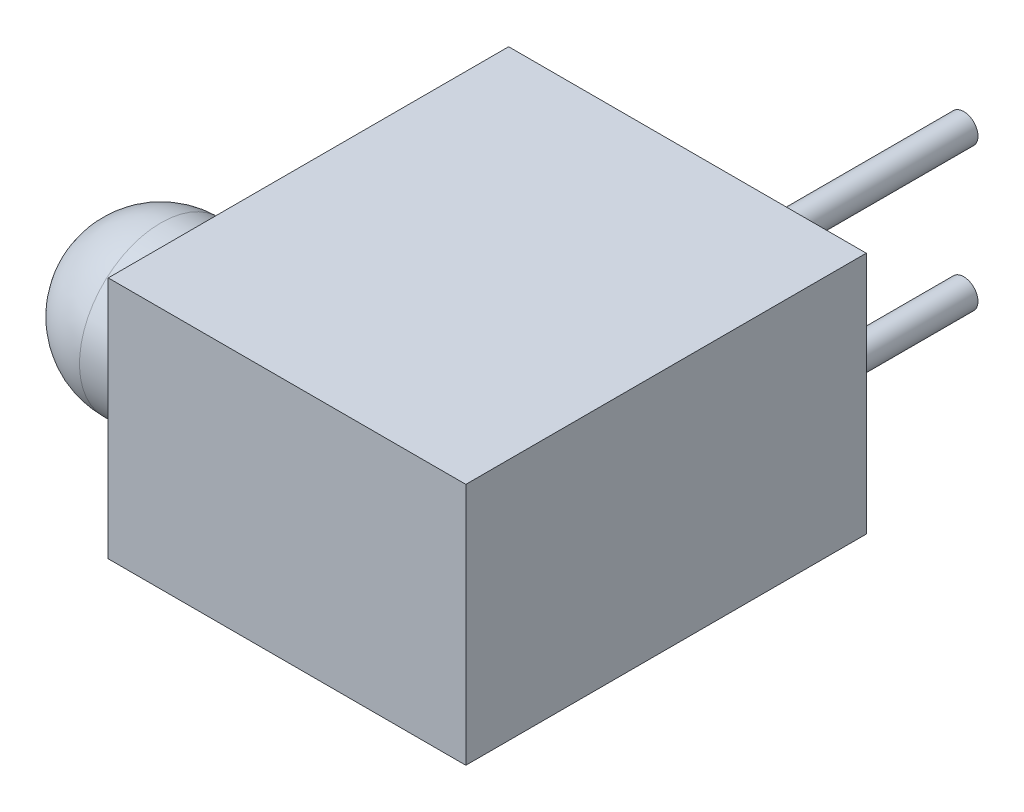
ISO-10303-21;
HEADER;
FILE_DESCRIPTION(('STEP AP214'),'2;1');
FILE_NAME('part.step','',(''),(''),'','','');
FILE_SCHEMA(('AUTOMOTIVE_DESIGN { 1 0 10303 214 1 1 1 1 }'));
ENDSEC;
DATA;
#1=APPLICATION_CONTEXT('core data for automotive mechanical design processes');
#2=APPLICATION_PROTOCOL_DEFINITION('international standard','automotive_design',2000,#1);
#3=PRODUCT_CONTEXT('',#1,'mechanical');
#4=PRODUCT('Part','Part','',(#3));
#5=PRODUCT_RELATED_PRODUCT_CATEGORY('part','',(#4));
#6=PRODUCT_DEFINITION_FORMATION('','',#4);
#7=PRODUCT_DEFINITION_CONTEXT('part definition',#1,'design');
#8=PRODUCT_DEFINITION('design','',#6,#7);
#9=PRODUCT_DEFINITION_SHAPE('','',#8);
#10=(LENGTH_UNIT() NAMED_UNIT(*) SI_UNIT(.MILLI.,.METRE.));
#11=(NAMED_UNIT(*) PLANE_ANGLE_UNIT() SI_UNIT($,.RADIAN.));
#12=(NAMED_UNIT(*) SI_UNIT($,.STERADIAN.) SOLID_ANGLE_UNIT());
#13=UNCERTAINTY_MEASURE_WITH_UNIT(LENGTH_MEASURE(1.E-05),#10,'distance_accuracy_value','');
#14=(GEOMETRIC_REPRESENTATION_CONTEXT(3) GLOBAL_UNCERTAINTY_ASSIGNED_CONTEXT((#13)) GLOBAL_UNIT_ASSIGNED_CONTEXT((#10,
#11,#12)) REPRESENTATION_CONTEXT('',''));
#15=CARTESIAN_POINT('',(0.,0.,0.));
#16=DIRECTION('',(0.,0.,1.));
#17=DIRECTION('',(1.,0.,0.));
#18=AXIS2_PLACEMENT_3D('',#15,#16,#17);
#19=CARTESIAN_POINT('',(-1.095,2.16,5.08));
#20=DIRECTION('',(1.,0.,0.));
#21=DIRECTION('',(0.,0.,-1.));
#22=AXIS2_PLACEMENT_3D('',#19,#20,#21);
#23=SPHERICAL_SURFACE('',#22,1.445);
#24=CARTESIAN_POINT('',(-2.54,2.16,5.08));
#25=VERTEX_POINT('',#24);
#26=VERTEX_LOOP('',#25);
#27=FACE_BOUND('',#26,.T.);
#28=CARTESIAN_POINT('',(-1.095,2.16,5.08));
#29=DIRECTION('',(1.,0.,0.));
#30=DIRECTION('',(0.,1.,0.));
#31=AXIS2_PLACEMENT_3D('',#28,#29,#30);
#32=CIRCLE('',#31,1.445);
#33=CARTESIAN_POINT('',(-1.095,3.605,5.08));
#34=VERTEX_POINT('',#33);
#35=EDGE_CURVE('E66',#34,#34,#32,.T.);
#36=ORIENTED_EDGE('',*,*,#35,.F.);
#37=EDGE_LOOP('',(#36));
#38=FACE_BOUND('',#37,.T.);
#39=ADVANCED_FACE('F17',(#27,#38),#23,.T.);
#40=CARTESIAN_POINT('',(4.4,0.890000000000001,-3.68));
#41=DIRECTION('',(0.,0.,-1.));
#42=DIRECTION('',(-1.,0.,0.));
#43=AXIS2_PLACEMENT_3D('',#40,#41,#42);
#44=PLANE('',#43);
#45=CARTESIAN_POINT('',(4.4,0.890000000000001,-3.68));
#46=DIRECTION('',(0.,0.,1.));
#47=DIRECTION('',(1.,0.,0.));
#48=AXIS2_PLACEMENT_3D('',#45,#46,#47);
#49=CIRCLE('',#48,0.254);
#50=CARTESIAN_POINT('',(4.654,0.890000000000001,-3.68));
#51=VERTEX_POINT('',#50);
#52=EDGE_CURVE('E21',#51,#51,#49,.T.);
#53=ORIENTED_EDGE('',*,*,#52,.F.);
#54=EDGE_LOOP('',(#53));
#55=FACE_BOUND('',#54,.T.);
#56=ADVANCED_FACE('F63',(#55),#44,.T.);
#57=CARTESIAN_POINT('',(4.4,3.43,-3.68));
#58=DIRECTION('',(0.,0.,-1.));
#59=DIRECTION('',(-1.,0.,0.));
#60=AXIS2_PLACEMENT_3D('',#57,#58,#59);
#61=PLANE('',#60);
#62=CARTESIAN_POINT('',(4.4,3.43,-3.68));
#63=DIRECTION('',(0.,0.,1.));
#64=DIRECTION('',(1.,0.,0.));
#65=AXIS2_PLACEMENT_3D('',#62,#63,#64);
#66=CIRCLE('',#65,0.254);
#67=CARTESIAN_POINT('',(4.654,3.43,-3.68));
#68=VERTEX_POINT('',#67);
#69=EDGE_CURVE('E70',#68,#68,#66,.T.);
#70=ORIENTED_EDGE('',*,*,#69,.F.);
#71=EDGE_LOOP('',(#70));
#72=FACE_BOUND('',#71,.T.);
#73=ADVANCED_FACE('F91',(#72),#61,.T.);
#74=CARTESIAN_POINT('',(-2.54,2.16,5.08));
#75=DIRECTION('',(1.,0.,0.));
#76=DIRECTION('',(0.,1.,0.));
#77=AXIS2_PLACEMENT_3D('',#74,#75,#76);
#78=CYLINDRICAL_SURFACE('',#77,1.445);
#79=ORIENTED_EDGE('',*,*,#35,.T.);
#80=EDGE_LOOP('',(#79));
#81=FACE_BOUND('',#80,.T.);
#82=CARTESIAN_POINT('',(0.,2.16,5.08));
#83=DIRECTION('',(1.,0.,0.));
#84=DIRECTION('',(0.,1.,0.));
#85=AXIS2_PLACEMENT_3D('',#82,#83,#84);
#86=CIRCLE('',#85,1.445);
#87=CARTESIAN_POINT('',(0.,3.605,5.08));
#88=VERTEX_POINT('',#87);
#89=EDGE_CURVE('E84',#88,#88,#86,.F.);
#90=ORIENTED_EDGE('',*,*,#89,.T.);
#91=EDGE_LOOP('',(#90));
#92=FACE_BOUND('',#91,.T.);
#93=ADVANCED_FACE('F93',(#81,#92),#78,.T.);
#94=CARTESIAN_POINT('',(4.4,0.890000000000001,-3.68));
#95=DIRECTION('',(0.,0.,1.));
#96=DIRECTION('',(1.,0.,0.));
#97=AXIS2_PLACEMENT_3D('',#94,#95,#96);
#98=CYLINDRICAL_SURFACE('',#97,0.254);
#99=CARTESIAN_POINT('',(4.4,0.890000000000001,0.));
#100=DIRECTION('',(0.,0.,1.));
#101=DIRECTION('',(1.,0.,0.));
#102=AXIS2_PLACEMENT_3D('',#99,#100,#101);
#103=CIRCLE('',#102,0.254);
#104=CARTESIAN_POINT('',(4.654,0.890000000000001,0.));
#105=VERTEX_POINT('',#104);
#106=EDGE_CURVE('E80',#105,#105,#103,.T.);
#107=ORIENTED_EDGE('',*,*,#106,.F.);
#108=EDGE_LOOP('',(#107));
#109=FACE_BOUND('',#108,.T.);
#110=ORIENTED_EDGE('',*,*,#52,.T.);
#111=EDGE_LOOP('',(#110));
#112=FACE_BOUND('',#111,.T.);
#113=ADVANCED_FACE('F100',(#109,#112),#98,.T.);
#114=CARTESIAN_POINT('',(4.4,3.43,-3.68));
#115=DIRECTION('',(0.,0.,1.));
#116=DIRECTION('',(1.,0.,0.));
#117=AXIS2_PLACEMENT_3D('',#114,#115,#116);
#118=CYLINDRICAL_SURFACE('',#117,0.254);
#119=CARTESIAN_POINT('',(4.4,3.43,0.));
#120=DIRECTION('',(0.,0.,1.));
#121=DIRECTION('',(1.,0.,0.));
#122=AXIS2_PLACEMENT_3D('',#119,#120,#121);
#123=CIRCLE('',#122,0.254);
#124=CARTESIAN_POINT('',(4.654,3.43,0.));
#125=VERTEX_POINT('',#124);
#126=EDGE_CURVE('E76',#125,#125,#123,.T.);
#127=ORIENTED_EDGE('',*,*,#126,.F.);
#128=EDGE_LOOP('',(#127));
#129=FACE_BOUND('',#128,.T.);
#130=ORIENTED_EDGE('',*,*,#69,.T.);
#131=EDGE_LOOP('',(#130));
#132=FACE_BOUND('',#131,.T.);
#133=ADVANCED_FACE('F89',(#129,#132),#118,.T.);
#134=CARTESIAN_POINT('',(0.,4.32,7.11));
#135=DIRECTION('',(0.,-1.,0.));
#136=DIRECTION('',(0.,0.,-1.));
#137=AXIS2_PLACEMENT_3D('',#134,#135,#136);
#138=PLANE('',#137);
#139=DIRECTION('',(0.,0.,1.));
#140=VECTOR('',#139,1.);
#141=CARTESIAN_POINT('',(0.,4.32,7.11));
#142=LINE('',#141,#140);
#143=CARTESIAN_POINT('',(0.,4.32,0.));
#144=VERTEX_POINT('',#143);
#145=CARTESIAN_POINT('',(0.,4.32,7.11));
#146=VERTEX_POINT('',#145);
#147=EDGE_CURVE('E72',#144,#146,#142,.T.);
#148=ORIENTED_EDGE('',*,*,#147,.T.);
#149=DIRECTION('',(-1.,0.,0.));
#150=VECTOR('',#149,1.);
#151=CARTESIAN_POINT('',(0.,4.32,7.11));
#152=LINE('',#151,#150);
#153=CARTESIAN_POINT('',(6.35,4.32,7.11));
#154=VERTEX_POINT('',#153);
#155=EDGE_CURVE('E57',#146,#154,#152,.F.);
#156=ORIENTED_EDGE('',*,*,#155,.T.);
#157=DIRECTION('',(0.,0.,1.));
#158=VECTOR('',#157,1.);
#159=CARTESIAN_POINT('',(6.35,4.32,7.11));
#160=LINE('',#159,#158);
#161=CARTESIAN_POINT('',(6.35,4.32,0.));
#162=VERTEX_POINT('',#161);
#163=EDGE_CURVE('E83',#154,#162,#160,.F.);
#164=ORIENTED_EDGE('',*,*,#163,.T.);
#165=DIRECTION('',(-1.,0.,0.));
#166=VECTOR('',#165,1.);
#167=CARTESIAN_POINT('',(0.,4.32,0.));
#168=LINE('',#167,#166);
#169=EDGE_CURVE('E262',#144,#162,#168,.F.);
#170=ORIENTED_EDGE('',*,*,#169,.F.);
#171=EDGE_LOOP('',(#148,#156,#164,#170));
#172=FACE_BOUND('',#171,.T.);
#173=ADVANCED_FACE('F124',(#172),#138,.F.);
#174=CARTESIAN_POINT('',(0.,0.,7.11));
#175=DIRECTION('',(1.,0.,0.));
#176=DIRECTION('',(0.,1.,0.));
#177=AXIS2_PLACEMENT_3D('',#174,#175,#176);
#178=PLANE('',#177);
#179=DIRECTION('',(0.,0.,1.));
#180=VECTOR('',#179,1.);
#181=CARTESIAN_POINT('',(0.,0.,7.11));
#182=LINE('',#181,#180);
#183=CARTESIAN_POINT('',(0.,0.,0.));
#184=VERTEX_POINT('',#183);
#185=CARTESIAN_POINT('',(0.,0.,7.11));
#186=VERTEX_POINT('',#185);
#187=EDGE_CURVE('E268',#184,#186,#182,.T.);
#188=ORIENTED_EDGE('',*,*,#187,.T.);
#189=DIRECTION('',(0.,1.,0.));
#190=VECTOR('',#189,1.);
#191=CARTESIAN_POINT('',(0.,4.32,7.11));
#192=LINE('',#191,#190);
#193=EDGE_CURVE('E266',#186,#146,#192,.T.);
#194=ORIENTED_EDGE('',*,*,#193,.T.);
#195=ORIENTED_EDGE('',*,*,#147,.F.);
#196=DIRECTION('',(0.,1.,0.));
#197=VECTOR('',#196,1.);
#198=CARTESIAN_POINT('',(0.,4.32,0.));
#199=LINE('',#198,#197);
#200=EDGE_CURVE('E79',#184,#144,#199,.T.);
#201=ORIENTED_EDGE('',*,*,#200,.F.);
#202=EDGE_LOOP('',(#188,#194,#195,#201));
#203=FACE_BOUND('',#202,.T.);
#204=ORIENTED_EDGE('',*,*,#89,.F.);
#205=EDGE_LOOP('',(#204));
#206=FACE_BOUND('',#205,.T.);
#207=ADVANCED_FACE('F121',(#203,#206),#178,.F.);
#208=CARTESIAN_POINT('',(0.,4.32,7.11));
#209=DIRECTION('',(0.,0.,-1.));
#210=DIRECTION('',(-1.,0.,0.));
#211=AXIS2_PLACEMENT_3D('',#208,#209,#210);
#212=PLANE('',#211);
#213=DIRECTION('',(1.,0.,0.));
#214=VECTOR('',#213,1.);
#215=CARTESIAN_POINT('',(0.,0.,7.11));
#216=LINE('',#215,#214);
#217=CARTESIAN_POINT('',(6.35,0.,7.11));
#218=VERTEX_POINT('',#217);
#219=EDGE_CURVE('E280',#186,#218,#216,.T.);
#220=ORIENTED_EDGE('',*,*,#219,.T.);
#221=DIRECTION('',(0.,1.,0.));
#222=VECTOR('',#221,1.);
#223=CARTESIAN_POINT('',(6.35,0.,7.11));
#224=LINE('',#223,#222);
#225=EDGE_CURVE('E271',#218,#154,#224,.T.);
#226=ORIENTED_EDGE('',*,*,#225,.T.);
#227=ORIENTED_EDGE('',*,*,#155,.F.);
#228=ORIENTED_EDGE('',*,*,#193,.F.);
#229=EDGE_LOOP('',(#220,#226,#227,#228));
#230=FACE_BOUND('',#229,.T.);
#231=ADVANCED_FACE('F117',(#230),#212,.F.);
#232=CARTESIAN_POINT('',(6.35,0.,7.11));
#233=DIRECTION('',(-1.,0.,0.));
#234=DIRECTION('',(0.,0.,1.));
#235=AXIS2_PLACEMENT_3D('',#232,#233,#234);
#236=PLANE('',#235);
#237=ORIENTED_EDGE('',*,*,#163,.F.);
#238=ORIENTED_EDGE('',*,*,#225,.F.);
#239=DIRECTION('',(0.,0.,1.));
#240=VECTOR('',#239,1.);
#241=CARTESIAN_POINT('',(6.35,0.,7.11));
#242=LINE('',#241,#240);
#243=CARTESIAN_POINT('',(6.35,0.,0.));
#244=VERTEX_POINT('',#243);
#245=EDGE_CURVE('E27',#218,#244,#242,.F.);
#246=ORIENTED_EDGE('',*,*,#245,.T.);
#247=DIRECTION('',(0.,1.,0.));
#248=VECTOR('',#247,1.);
#249=CARTESIAN_POINT('',(6.35,4.32,0.));
#250=LINE('',#249,#248);
#251=EDGE_CURVE('E35',#162,#244,#250,.F.);
#252=ORIENTED_EDGE('',*,*,#251,.F.);
#253=EDGE_LOOP('',(#237,#238,#246,#252));
#254=FACE_BOUND('',#253,.T.);
#255=ADVANCED_FACE('F111',(#254),#236,.F.);
#256=CARTESIAN_POINT('',(0.,4.32,0.));
#257=DIRECTION('',(0.,0.,-1.));
#258=DIRECTION('',(-1.,0.,0.));
#259=AXIS2_PLACEMENT_3D('',#256,#257,#258);
#260=PLANE('',#259);
#261=ORIENTED_EDGE('',*,*,#251,.T.);
#262=DIRECTION('',(1.,0.,0.));
#263=VECTOR('',#262,1.);
#264=CARTESIAN_POINT('',(0.,0.,0.));
#265=LINE('',#264,#263);
#266=EDGE_CURVE('E11',#244,#184,#265,.F.);
#267=ORIENTED_EDGE('',*,*,#266,.T.);
#268=ORIENTED_EDGE('',*,*,#200,.T.);
#269=ORIENTED_EDGE('',*,*,#169,.T.);
#270=EDGE_LOOP('',(#261,#267,#268,#269));
#271=FACE_BOUND('',#270,.T.);
#272=ORIENTED_EDGE('',*,*,#126,.T.);
#273=EDGE_LOOP('',(#272));
#274=FACE_BOUND('',#273,.T.);
#275=ORIENTED_EDGE('',*,*,#106,.T.);
#276=EDGE_LOOP('',(#275));
#277=FACE_BOUND('',#276,.T.);
#278=ADVANCED_FACE('F105',(#271,#274,#277),#260,.T.);
#279=CARTESIAN_POINT('',(0.,0.,7.11));
#280=DIRECTION('',(0.,1.,0.));
#281=DIRECTION('',(0.,0.,1.));
#282=AXIS2_PLACEMENT_3D('',#279,#280,#281);
#283=PLANE('',#282);
#284=ORIENTED_EDGE('',*,*,#245,.F.);
#285=ORIENTED_EDGE('',*,*,#219,.F.);
#286=ORIENTED_EDGE('',*,*,#187,.F.);
#287=ORIENTED_EDGE('',*,*,#266,.F.);
#288=EDGE_LOOP('',(#284,#285,#286,#287));
#289=FACE_BOUND('',#288,.T.);
#290=ADVANCED_FACE('F103',(#289),#283,.F.);
#291=CLOSED_SHELL('',(#39,#56,#73,#93,#113,#133,#173,#207,#231,#255,#278,#290));
#292=MANIFOLD_SOLID_BREP('B1',#291);
#293=ADVANCED_BREP_SHAPE_REPRESENTATION('',(#18,#292),#14);
#294=SHAPE_DEFINITION_REPRESENTATION(#9,#293);
ENDSEC;
END-ISO-10303-21;
